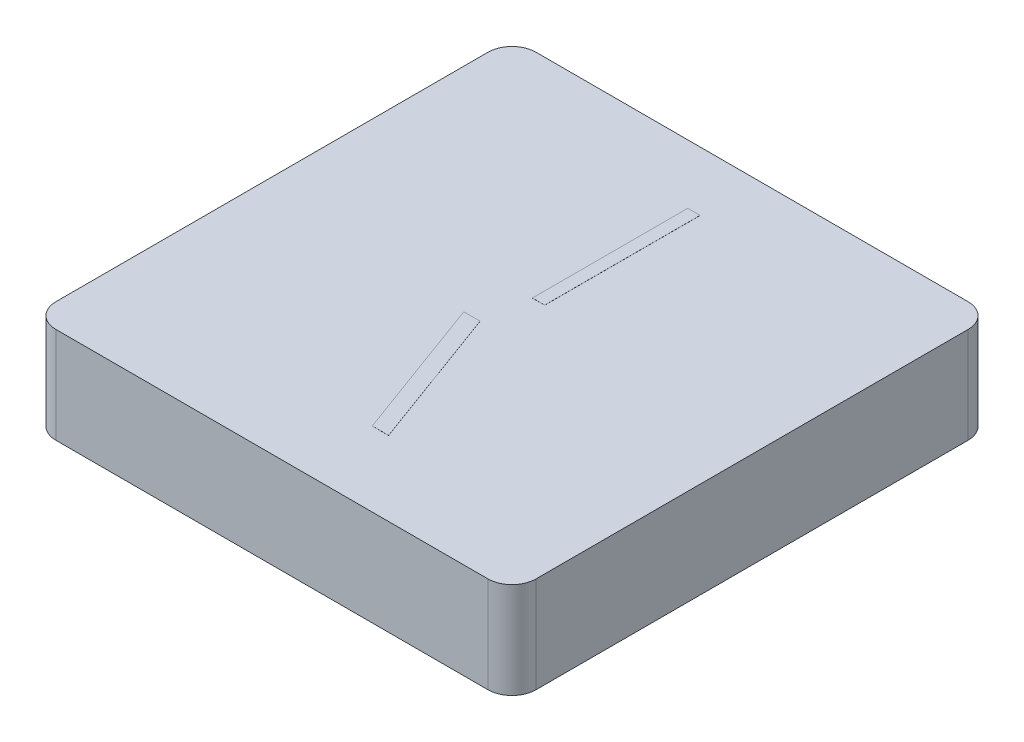
ISO-10303-21;
HEADER;
FILE_DESCRIPTION(('STEP AP214'),'2;1');
FILE_NAME('part.step','',(''),(''),'','','');
FILE_SCHEMA(('AUTOMOTIVE_DESIGN { 1 0 10303 214 1 1 1 1 }'));
ENDSEC;
DATA;
#1=APPLICATION_CONTEXT('core data for automotive mechanical design processes');
#2=APPLICATION_PROTOCOL_DEFINITION('international standard','automotive_design',2000,#1);
#3=PRODUCT_CONTEXT('',#1,'mechanical');
#4=PRODUCT('Part','Part','',(#3));
#5=PRODUCT_RELATED_PRODUCT_CATEGORY('part','',(#4));
#6=PRODUCT_DEFINITION_FORMATION('','',#4);
#7=PRODUCT_DEFINITION_CONTEXT('part definition',#1,'design');
#8=PRODUCT_DEFINITION('design','',#6,#7);
#9=PRODUCT_DEFINITION_SHAPE('','',#8);
#10=(LENGTH_UNIT() NAMED_UNIT(*) SI_UNIT(.MILLI.,.METRE.));
#11=(NAMED_UNIT(*) PLANE_ANGLE_UNIT() SI_UNIT($,.RADIAN.));
#12=(NAMED_UNIT(*) SI_UNIT($,.STERADIAN.) SOLID_ANGLE_UNIT());
#13=UNCERTAINTY_MEASURE_WITH_UNIT(LENGTH_MEASURE(1.E-05),#10,'distance_accuracy_value','');
#14=(GEOMETRIC_REPRESENTATION_CONTEXT(3) GLOBAL_UNCERTAINTY_ASSIGNED_CONTEXT((#13)) GLOBAL_UNIT_ASSIGNED_CONTEXT((#10,
#11,#12)) REPRESENTATION_CONTEXT('',''));
#15=CARTESIAN_POINT('',(0.,0.,0.));
#16=DIRECTION('',(0.,0.,1.));
#17=DIRECTION('',(1.,0.,0.));
#18=AXIS2_PLACEMENT_3D('',#15,#16,#17);
#19=CARTESIAN_POINT('',(0.,2.54,-12.7));
#20=DIRECTION('',(1.,0.,0.));
#21=DIRECTION('',(0.,0.,-1.));
#22=AXIS2_PLACEMENT_3D('',#19,#20,#21);
#23=PLANE('',#22);
#24=DIRECTION('',(0.,0.,1.));
#25=VECTOR('',#24,1.);
#26=CARTESIAN_POINT('',(0.,2.54,-12.7));
#27=LINE('',#26,#25);
#28=CARTESIAN_POINT('',(0.,2.54,-12.065));
#29=VERTEX_POINT('',#28);
#30=CARTESIAN_POINT('',(0.,2.54,-0.635));
#31=VERTEX_POINT('',#30);
#32=EDGE_CURVE('E279',#29,#31,#27,.T.);
#33=ORIENTED_EDGE('',*,*,#32,.F.);
#34=DIRECTION('',(0.,-1.,0.));
#35=VECTOR('',#34,1.);
#36=CARTESIAN_POINT('',(0.,2.54,-12.065));
#37=LINE('',#36,#35);
#38=CARTESIAN_POINT('',(0.,0.,-12.065));
#39=VERTEX_POINT('',#38);
#40=EDGE_CURVE('E304',#29,#39,#37,.T.);
#41=ORIENTED_EDGE('',*,*,#40,.T.);
#42=DIRECTION('',(0.,0.,1.));
#43=VECTOR('',#42,1.);
#44=CARTESIAN_POINT('',(0.,0.,-12.7));
#45=LINE('',#44,#43);
#46=CARTESIAN_POINT('',(0.,0.,-0.635));
#47=VERTEX_POINT('',#46);
#48=EDGE_CURVE('E259',#39,#47,#45,.T.);
#49=ORIENTED_EDGE('',*,*,#48,.T.);
#50=DIRECTION('',(0.,-1.,0.));
#51=VECTOR('',#50,1.);
#52=CARTESIAN_POINT('',(0.,2.54,-0.635));
#53=LINE('',#52,#51);
#54=EDGE_CURVE('E292',#47,#31,#53,.F.);
#55=ORIENTED_EDGE('',*,*,#54,.T.);
#56=EDGE_LOOP('',(#33,#41,#49,#55));
#57=FACE_BOUND('',#56,.T.);
#58=ADVANCED_FACE('F33',(#57),#23,.F.);
#59=CARTESIAN_POINT('',(0.,2.54,0.));
#60=DIRECTION('',(0.,0.,-1.));
#61=DIRECTION('',(-1.,0.,0.));
#62=AXIS2_PLACEMENT_3D('',#59,#60,#61);
#63=PLANE('',#62);
#64=DIRECTION('',(1.,0.,0.));
#65=VECTOR('',#64,1.);
#66=CARTESIAN_POINT('',(0.,0.,0.));
#67=LINE('',#66,#65);
#68=CARTESIAN_POINT('',(0.635,0.,0.));
#69=VERTEX_POINT('',#68);
#70=CARTESIAN_POINT('',(12.065,0.,0.));
#71=VERTEX_POINT('',#70);
#72=EDGE_CURVE('E295',#69,#71,#67,.T.);
#73=ORIENTED_EDGE('',*,*,#72,.T.);
#74=DIRECTION('',(0.,-1.,0.));
#75=VECTOR('',#74,1.);
#76=CARTESIAN_POINT('',(12.065,2.54,0.));
#77=LINE('',#76,#75);
#78=CARTESIAN_POINT('',(12.065,2.54,0.));
#79=VERTEX_POINT('',#78);
#80=EDGE_CURVE('E41',#71,#79,#77,.F.);
#81=ORIENTED_EDGE('',*,*,#80,.T.);
#82=DIRECTION('',(1.,0.,0.));
#83=VECTOR('',#82,1.);
#84=CARTESIAN_POINT('',(0.,2.54,0.));
#85=LINE('',#84,#83);
#86=CARTESIAN_POINT('',(0.635,2.54,0.));
#87=VERTEX_POINT('',#86);
#88=EDGE_CURVE('E282',#87,#79,#85,.T.);
#89=ORIENTED_EDGE('',*,*,#88,.F.);
#90=DIRECTION('',(0.,-1.,0.));
#91=VECTOR('',#90,1.);
#92=CARTESIAN_POINT('',(0.635,2.54,0.));
#93=LINE('',#92,#91);
#94=EDGE_CURVE('E333',#87,#69,#93,.T.);
#95=ORIENTED_EDGE('',*,*,#94,.T.);
#96=EDGE_LOOP('',(#73,#81,#89,#95));
#97=FACE_BOUND('',#96,.T.);
#98=ADVANCED_FACE('F338',(#97),#63,.F.);
#99=CARTESIAN_POINT('',(12.7,2.54,0.));
#100=DIRECTION('',(-1.,0.,0.));
#101=DIRECTION('',(0.,0.,1.));
#102=AXIS2_PLACEMENT_3D('',#99,#100,#101);
#103=PLANE('',#102);
#104=DIRECTION('',(0.,0.,-1.));
#105=VECTOR('',#104,1.);
#106=CARTESIAN_POINT('',(12.7,0.,0.));
#107=LINE('',#106,#105);
#108=CARTESIAN_POINT('',(12.7,0.,-0.635));
#109=VERTEX_POINT('',#108);
#110=CARTESIAN_POINT('',(12.7,0.,-12.065));
#111=VERTEX_POINT('',#110);
#112=EDGE_CURVE('E298',#109,#111,#107,.T.);
#113=ORIENTED_EDGE('',*,*,#112,.T.);
#114=DIRECTION('',(0.,-1.,0.));
#115=VECTOR('',#114,1.);
#116=CARTESIAN_POINT('',(12.7,2.54,-12.065));
#117=LINE('',#116,#115);
#118=CARTESIAN_POINT('',(12.7,2.54,-12.065));
#119=VERTEX_POINT('',#118);
#120=EDGE_CURVE('E331',#111,#119,#117,.F.);
#121=ORIENTED_EDGE('',*,*,#120,.T.);
#122=DIRECTION('',(0.,0.,-1.));
#123=VECTOR('',#122,1.);
#124=CARTESIAN_POINT('',(12.7,2.54,0.));
#125=LINE('',#124,#123);
#126=CARTESIAN_POINT('',(12.7,2.54,-0.635));
#127=VERTEX_POINT('',#126);
#128=EDGE_CURVE('E286',#127,#119,#125,.T.);
#129=ORIENTED_EDGE('',*,*,#128,.F.);
#130=DIRECTION('',(0.,-1.,0.));
#131=VECTOR('',#130,1.);
#132=CARTESIAN_POINT('',(12.7,2.54,-0.635));
#133=LINE('',#132,#131);
#134=EDGE_CURVE('E328',#127,#109,#133,.T.);
#135=ORIENTED_EDGE('',*,*,#134,.T.);
#136=EDGE_LOOP('',(#113,#121,#129,#135));
#137=FACE_BOUND('',#136,.T.);
#138=ADVANCED_FACE('F351',(#137),#103,.F.);
#139=CARTESIAN_POINT('',(12.7,2.54,-12.7));
#140=DIRECTION('',(0.,0.,1.));
#141=DIRECTION('',(1.,0.,0.));
#142=AXIS2_PLACEMENT_3D('',#139,#140,#141);
#143=PLANE('',#142);
#144=DIRECTION('',(-1.,0.,0.));
#145=VECTOR('',#144,1.);
#146=CARTESIAN_POINT('',(12.7,0.,-12.7));
#147=LINE('',#146,#145);
#148=CARTESIAN_POINT('',(12.065,0.,-12.7));
#149=VERTEX_POINT('',#148);
#150=CARTESIAN_POINT('',(0.634999999999995,0.,-12.7));
#151=VERTEX_POINT('',#150);
#152=EDGE_CURVE('E283',#149,#151,#147,.T.);
#153=ORIENTED_EDGE('',*,*,#152,.T.);
#154=DIRECTION('',(0.,-1.,0.));
#155=VECTOR('',#154,1.);
#156=CARTESIAN_POINT('',(0.634999999999995,2.54,-12.7));
#157=LINE('',#156,#155);
#158=CARTESIAN_POINT('',(0.634999999999995,2.54,-12.7));
#159=VERTEX_POINT('',#158);
#160=EDGE_CURVE('E318',#151,#159,#157,.F.);
#161=ORIENTED_EDGE('',*,*,#160,.T.);
#162=DIRECTION('',(-1.,0.,0.));
#163=VECTOR('',#162,1.);
#164=CARTESIAN_POINT('',(12.7,2.54,-12.7));
#165=LINE('',#164,#163);
#166=CARTESIAN_POINT('',(12.065,2.54,-12.7));
#167=VERTEX_POINT('',#166);
#168=EDGE_CURVE('E289',#167,#159,#165,.T.);
#169=ORIENTED_EDGE('',*,*,#168,.F.);
#170=DIRECTION('',(0.,-1.,0.));
#171=VECTOR('',#170,1.);
#172=CARTESIAN_POINT('',(12.065,2.54,-12.7));
#173=LINE('',#172,#171);
#174=EDGE_CURVE('E315',#167,#149,#173,.T.);
#175=ORIENTED_EDGE('',*,*,#174,.T.);
#176=EDGE_LOOP('',(#153,#161,#169,#175));
#177=FACE_BOUND('',#176,.T.);
#178=ADVANCED_FACE('F363',(#177),#143,.F.);
#179=CARTESIAN_POINT('',(0.,2.54,0.));
#180=DIRECTION('',(0.,1.,0.));
#181=DIRECTION('',(0.,0.,1.));
#182=AXIS2_PLACEMENT_3D('',#179,#180,#181);
#183=PLANE('',#182);
#184=DIRECTION('',(0.,0.,-1.));
#185=VECTOR('',#184,1.);
#186=CARTESIAN_POINT('',(6.21974358974359,2.54,-7.01919230769231));
#187=LINE('',#186,#185);
#188=CARTESIAN_POINT('',(6.21974358974359,2.54,-7.01919230769231));
#189=VERTEX_POINT('',#188);
#190=CARTESIAN_POINT('',(6.21974358974359,2.54,-11.1304102564103));
#191=VERTEX_POINT('',#190);
#192=EDGE_CURVE('E199',#189,#191,#187,.T.);
#193=ORIENTED_EDGE('',*,*,#192,.T.);
#194=DIRECTION('',(1.,0.,0.));
#195=VECTOR('',#194,1.);
#196=CARTESIAN_POINT('',(6.21974358974359,2.54,-11.1304102564103));
#197=LINE('',#196,#195);
#198=CARTESIAN_POINT('',(6.54538461538461,2.54,-11.1304102564103));
#199=VERTEX_POINT('',#198);
#200=EDGE_CURVE('E175',#191,#199,#197,.T.);
#201=ORIENTED_EDGE('',*,*,#200,.T.);
#202=DIRECTION('',(0.,0.,1.));
#203=VECTOR('',#202,1.);
#204=CARTESIAN_POINT('',(6.54538461538461,2.54,-11.1304102564103));
#205=LINE('',#204,#203);
#206=CARTESIAN_POINT('',(6.54538461538461,2.54,-7.01919230769231));
#207=VERTEX_POINT('',#206);
#208=EDGE_CURVE('E53',#199,#207,#205,.T.);
#209=ORIENTED_EDGE('',*,*,#208,.T.);
#210=DIRECTION('',(-1.,0.,0.));
#211=VECTOR('',#210,1.);
#212=CARTESIAN_POINT('',(6.54538461538461,2.54,-7.01919230769231));
#213=LINE('',#212,#211);
#214=EDGE_CURVE('E48',#207,#189,#213,.T.);
#215=ORIENTED_EDGE('',*,*,#214,.T.);
#216=EDGE_LOOP('',(#193,#201,#209,#215));
#217=FACE_BOUND('',#216,.T.);
#218=DIRECTION('',(0.344823073975085,0.,0.93866769820548));
#219=VECTOR('',#218,1.);
#220=CARTESIAN_POINT('',(6.05936538461538,2.54,-5.79641025641026));
#221=LINE('',#220,#219);
#222=CARTESIAN_POINT('',(6.05936538461538,2.54,-5.79641025641026));
#223=VERTEX_POINT('',#222);
#224=CARTESIAN_POINT('',(7.46496434294871,2.54,-1.9701282051282));
#225=VERTEX_POINT('',#224);
#226=EDGE_CURVE('E204',#223,#225,#221,.T.);
#227=ORIENTED_EDGE('',*,*,#226,.T.);
#228=DIRECTION('',(-1.,0.,0.));
#229=VECTOR('',#228,1.);
#230=CARTESIAN_POINT('',(7.46496434294871,2.54,-1.9701282051282));
#231=LINE('',#230,#229);
#232=CARTESIAN_POINT('',(7.03374439102564,2.54,-1.9701282051282));
#233=VERTEX_POINT('',#232);
#234=EDGE_CURVE('E223',#225,#233,#231,.T.);
#235=ORIENTED_EDGE('',*,*,#234,.T.);
#236=DIRECTION('',(-0.344823073975085,0.,-0.93866769820548));
#237=VECTOR('',#236,1.);
#238=CARTESIAN_POINT('',(7.03374439102564,2.54,-1.9701282051282));
#239=LINE('',#238,#237);
#240=CARTESIAN_POINT('',(5.6281454326923,2.54,-5.79641025641026));
#241=VERTEX_POINT('',#240);
#242=EDGE_CURVE('E225',#233,#241,#239,.T.);
#243=ORIENTED_EDGE('',*,*,#242,.T.);
#244=DIRECTION('',(1.,0.,0.));
#245=VECTOR('',#244,1.);
#246=CARTESIAN_POINT('',(5.6281454326923,2.54,-5.79641025641026));
#247=LINE('',#246,#245);
#248=EDGE_CURVE('E212',#241,#223,#247,.T.);
#249=ORIENTED_EDGE('',*,*,#248,.T.);
#250=EDGE_LOOP('',(#227,#235,#243,#249));
#251=FACE_BOUND('',#250,.T.);
#252=ORIENTED_EDGE('',*,*,#168,.T.);
#253=CARTESIAN_POINT('',(0.634999999999995,2.54,-12.065));
#254=DIRECTION('',(0.,1.,0.));
#255=DIRECTION('',(0.,0.,1.));
#256=AXIS2_PLACEMENT_3D('',#253,#254,#255);
#257=CIRCLE('',#256,0.635);
#258=EDGE_CURVE('E326',#159,#29,#257,.T.);
#259=ORIENTED_EDGE('',*,*,#258,.T.);
#260=ORIENTED_EDGE('',*,*,#32,.T.);
#261=CARTESIAN_POINT('',(0.635,2.54,-0.635));
#262=DIRECTION('',(0.,1.,0.));
#263=DIRECTION('',(0.,0.,1.));
#264=AXIS2_PLACEMENT_3D('',#261,#262,#263);
#265=CIRCLE('',#264,0.635);
#266=EDGE_CURVE('E320',#31,#87,#265,.T.);
#267=ORIENTED_EDGE('',*,*,#266,.T.);
#268=ORIENTED_EDGE('',*,*,#88,.T.);
#269=CARTESIAN_POINT('',(12.065,2.54,-0.635));
#270=DIRECTION('',(0.,1.,0.));
#271=DIRECTION('',(0.,0.,1.));
#272=AXIS2_PLACEMENT_3D('',#269,#270,#271);
#273=CIRCLE('',#272,0.635);
#274=EDGE_CURVE('E322',#79,#127,#273,.T.);
#275=ORIENTED_EDGE('',*,*,#274,.T.);
#276=ORIENTED_EDGE('',*,*,#128,.T.);
#277=CARTESIAN_POINT('',(12.065,2.54,-12.065));
#278=DIRECTION('',(0.,1.,0.));
#279=DIRECTION('',(0.,0.,1.));
#280=AXIS2_PLACEMENT_3D('',#277,#278,#279);
#281=CIRCLE('',#280,0.635);
#282=EDGE_CURVE('E324',#119,#167,#281,.T.);
#283=ORIENTED_EDGE('',*,*,#282,.T.);
#284=EDGE_LOOP('',(#252,#259,#260,#267,#268,#275,#276,#283));
#285=FACE_BOUND('',#284,.T.);
#286=ADVANCED_FACE('F344',(#217,#251,#285),#183,.T.);
#287=CARTESIAN_POINT('',(0.,0.,0.));
#288=DIRECTION('',(0.,1.,0.));
#289=DIRECTION('',(0.,0.,1.));
#290=AXIS2_PLACEMENT_3D('',#287,#288,#289);
#291=PLANE('',#290);
#292=DIRECTION('',(-1.,0.,0.));
#293=VECTOR('',#292,1.);
#294=CARTESIAN_POINT('',(12.7,0.,-12.065));
#295=LINE('',#294,#293);
#296=CARTESIAN_POINT('',(12.065,0.,-12.065));
#297=VERTEX_POINT('',#296);
#298=CARTESIAN_POINT('',(0.634999999999995,0.,-12.065));
#299=VERTEX_POINT('',#298);
#300=EDGE_CURVE('E247',#297,#299,#295,.T.);
#301=ORIENTED_EDGE('',*,*,#300,.T.);
#302=DIRECTION('',(0.,0.,1.));
#303=VECTOR('',#302,1.);
#304=CARTESIAN_POINT('',(0.634999999999995,0.,-12.7));
#305=LINE('',#304,#303);
#306=CARTESIAN_POINT('',(0.635,0.,-0.635));
#307=VERTEX_POINT('',#306);
#308=EDGE_CURVE('E242',#299,#307,#305,.T.);
#309=ORIENTED_EDGE('',*,*,#308,.T.);
#310=DIRECTION('',(1.,0.,0.));
#311=VECTOR('',#310,1.);
#312=CARTESIAN_POINT('',(0.,0.,-0.635));
#313=LINE('',#312,#311);
#314=CARTESIAN_POINT('',(12.065,0.,-0.635));
#315=VERTEX_POINT('',#314);
#316=EDGE_CURVE('E271',#307,#315,#313,.T.);
#317=ORIENTED_EDGE('',*,*,#316,.T.);
#318=DIRECTION('',(0.,0.,-1.));
#319=VECTOR('',#318,1.);
#320=CARTESIAN_POINT('',(12.065,0.,0.));
#321=LINE('',#320,#319);
#322=EDGE_CURVE('E274',#315,#297,#321,.T.);
#323=ORIENTED_EDGE('',*,*,#322,.T.);
#324=EDGE_LOOP('',(#301,#309,#317,#323));
#325=FACE_BOUND('',#324,.T.);
#326=ORIENTED_EDGE('',*,*,#48,.F.);
#327=CARTESIAN_POINT('',(0.634999999999995,0.,-12.065));
#328=DIRECTION('',(0.,1.,0.));
#329=DIRECTION('',(0.,0.,1.));
#330=AXIS2_PLACEMENT_3D('',#327,#328,#329);
#331=CIRCLE('',#330,0.635);
#332=EDGE_CURVE('E313',#39,#151,#331,.F.);
#333=ORIENTED_EDGE('',*,*,#332,.T.);
#334=ORIENTED_EDGE('',*,*,#152,.F.);
#335=CARTESIAN_POINT('',(12.065,0.,-12.065));
#336=DIRECTION('',(0.,1.,0.));
#337=DIRECTION('',(0.,0.,1.));
#338=AXIS2_PLACEMENT_3D('',#335,#336,#337);
#339=CIRCLE('',#338,0.635);
#340=EDGE_CURVE('E311',#149,#111,#339,.F.);
#341=ORIENTED_EDGE('',*,*,#340,.T.);
#342=ORIENTED_EDGE('',*,*,#112,.F.);
#343=CARTESIAN_POINT('',(12.065,0.,-0.635));
#344=DIRECTION('',(0.,1.,0.));
#345=DIRECTION('',(0.,0.,1.));
#346=AXIS2_PLACEMENT_3D('',#343,#344,#345);
#347=CIRCLE('',#346,0.635);
#348=EDGE_CURVE('E309',#109,#71,#347,.F.);
#349=ORIENTED_EDGE('',*,*,#348,.T.);
#350=ORIENTED_EDGE('',*,*,#72,.F.);
#351=CARTESIAN_POINT('',(0.635,0.,-0.635));
#352=DIRECTION('',(0.,1.,0.));
#353=DIRECTION('',(0.,0.,1.));
#354=AXIS2_PLACEMENT_3D('',#351,#352,#353);
#355=CIRCLE('',#354,0.635);
#356=EDGE_CURVE('E307',#69,#47,#355,.F.);
#357=ORIENTED_EDGE('',*,*,#356,.T.);
#358=EDGE_LOOP('',(#326,#333,#334,#341,#342,#349,#350,#357));
#359=FACE_BOUND('',#358,.T.);
#360=ADVANCED_FACE('F355',(#325,#359),#291,.F.);
#361=CARTESIAN_POINT('',(0.634999999999995,2.54,-12.065));
#362=DIRECTION('',(0.,-1.,0.));
#363=DIRECTION('',(0.,0.,-1.));
#364=AXIS2_PLACEMENT_3D('',#361,#362,#363);
#365=CYLINDRICAL_SURFACE('',#364,0.635);
#366=ORIENTED_EDGE('',*,*,#258,.F.);
#367=ORIENTED_EDGE('',*,*,#160,.F.);
#368=ORIENTED_EDGE('',*,*,#332,.F.);
#369=ORIENTED_EDGE('',*,*,#40,.F.);
#370=EDGE_LOOP('',(#366,#367,#368,#369));
#371=FACE_BOUND('',#370,.T.);
#372=ADVANCED_FACE('F369',(#371),#365,.T.);
#373=CARTESIAN_POINT('',(12.065,2.54,-12.065));
#374=DIRECTION('',(0.,-1.,0.));
#375=DIRECTION('',(0.,0.,-1.));
#376=AXIS2_PLACEMENT_3D('',#373,#374,#375);
#377=CYLINDRICAL_SURFACE('',#376,0.635);
#378=ORIENTED_EDGE('',*,*,#282,.F.);
#379=ORIENTED_EDGE('',*,*,#120,.F.);
#380=ORIENTED_EDGE('',*,*,#340,.F.);
#381=ORIENTED_EDGE('',*,*,#174,.F.);
#382=EDGE_LOOP('',(#378,#379,#380,#381));
#383=FACE_BOUND('',#382,.T.);
#384=ADVANCED_FACE('F360',(#383),#377,.T.);
#385=CARTESIAN_POINT('',(12.065,2.54,-0.635));
#386=DIRECTION('',(0.,-1.,0.));
#387=DIRECTION('',(0.,0.,-1.));
#388=AXIS2_PLACEMENT_3D('',#385,#386,#387);
#389=CYLINDRICAL_SURFACE('',#388,0.635);
#390=ORIENTED_EDGE('',*,*,#274,.F.);
#391=ORIENTED_EDGE('',*,*,#80,.F.);
#392=ORIENTED_EDGE('',*,*,#348,.F.);
#393=ORIENTED_EDGE('',*,*,#134,.F.);
#394=EDGE_LOOP('',(#390,#391,#392,#393));
#395=FACE_BOUND('',#394,.T.);
#396=ADVANCED_FACE('F348',(#395),#389,.T.);
#397=CARTESIAN_POINT('',(0.635,2.54,-0.635));
#398=DIRECTION('',(0.,-1.,0.));
#399=DIRECTION('',(0.,0.,-1.));
#400=AXIS2_PLACEMENT_3D('',#397,#398,#399);
#401=CYLINDRICAL_SURFACE('',#400,0.635);
#402=ORIENTED_EDGE('',*,*,#266,.F.);
#403=ORIENTED_EDGE('',*,*,#54,.F.);
#404=ORIENTED_EDGE('',*,*,#356,.F.);
#405=ORIENTED_EDGE('',*,*,#94,.F.);
#406=EDGE_LOOP('',(#402,#403,#404,#405));
#407=FACE_BOUND('',#406,.T.);
#408=ADVANCED_FACE('F35',(#407),#401,.T.);
#409=CARTESIAN_POINT('',(0.634999999999995,2.54,-12.7));
#410=DIRECTION('',(1.,0.,0.));
#411=DIRECTION('',(0.,0.,-1.));
#412=AXIS2_PLACEMENT_3D('',#409,#410,#411);
#413=PLANE('',#412);
#414=DIRECTION('',(0.,0.,1.));
#415=VECTOR('',#414,1.);
#416=CARTESIAN_POINT('',(0.634999999999995,1.905,-12.7));
#417=LINE('',#416,#415);
#418=CARTESIAN_POINT('',(0.634999999999995,1.905,-12.065));
#419=VERTEX_POINT('',#418);
#420=CARTESIAN_POINT('',(0.635,1.905,-0.635));
#421=VERTEX_POINT('',#420);
#422=EDGE_CURVE('E243',#419,#421,#417,.T.);
#423=ORIENTED_EDGE('',*,*,#422,.T.);
#424=DIRECTION('',(0.,1.,0.));
#425=VECTOR('',#424,1.);
#426=CARTESIAN_POINT('',(0.635,2.54,-0.635));
#427=LINE('',#426,#425);
#428=EDGE_CURVE('E252',#307,#421,#427,.T.);
#429=ORIENTED_EDGE('',*,*,#428,.F.);
#430=ORIENTED_EDGE('',*,*,#308,.F.);
#431=DIRECTION('',(0.,1.,0.));
#432=VECTOR('',#431,1.);
#433=CARTESIAN_POINT('',(0.634999999999995,2.54,-12.065));
#434=LINE('',#433,#432);
#435=EDGE_CURVE('E248',#299,#419,#434,.T.);
#436=ORIENTED_EDGE('',*,*,#435,.T.);
#437=EDGE_LOOP('',(#423,#429,#430,#436));
#438=FACE_BOUND('',#437,.T.);
#439=ADVANCED_FACE('F374',(#438),#413,.T.);
#440=CARTESIAN_POINT('',(0.,2.54,-0.635));
#441=DIRECTION('',(0.,0.,-1.));
#442=DIRECTION('',(-1.,0.,0.));
#443=AXIS2_PLACEMENT_3D('',#440,#441,#442);
#444=PLANE('',#443);
#445=ORIENTED_EDGE('',*,*,#316,.F.);
#446=ORIENTED_EDGE('',*,*,#428,.T.);
#447=DIRECTION('',(1.,0.,0.));
#448=VECTOR('',#447,1.);
#449=CARTESIAN_POINT('',(0.,1.905,-0.635));
#450=LINE('',#449,#448);
#451=CARTESIAN_POINT('',(12.065,1.905,-0.635));
#452=VERTEX_POINT('',#451);
#453=EDGE_CURVE('E246',#421,#452,#450,.T.);
#454=ORIENTED_EDGE('',*,*,#453,.T.);
#455=DIRECTION('',(0.,1.,0.));
#456=VECTOR('',#455,1.);
#457=CARTESIAN_POINT('',(12.065,2.54,-0.635));
#458=LINE('',#457,#456);
#459=EDGE_CURVE('E256',#315,#452,#458,.T.);
#460=ORIENTED_EDGE('',*,*,#459,.F.);
#461=EDGE_LOOP('',(#445,#446,#454,#460));
#462=FACE_BOUND('',#461,.T.);
#463=ADVANCED_FACE('F379',(#462),#444,.T.);
#464=CARTESIAN_POINT('',(12.065,2.54,0.));
#465=DIRECTION('',(-1.,0.,0.));
#466=DIRECTION('',(0.,0.,1.));
#467=AXIS2_PLACEMENT_3D('',#464,#465,#466);
#468=PLANE('',#467);
#469=ORIENTED_EDGE('',*,*,#322,.F.);
#470=ORIENTED_EDGE('',*,*,#459,.T.);
#471=DIRECTION('',(0.,0.,-1.));
#472=VECTOR('',#471,1.);
#473=CARTESIAN_POINT('',(12.065,1.905,0.));
#474=LINE('',#473,#472);
#475=CARTESIAN_POINT('',(12.065,1.905,-12.065));
#476=VERTEX_POINT('',#475);
#477=EDGE_CURVE('E262',#452,#476,#474,.T.);
#478=ORIENTED_EDGE('',*,*,#477,.T.);
#479=DIRECTION('',(0.,1.,0.));
#480=VECTOR('',#479,1.);
#481=CARTESIAN_POINT('',(12.065,2.54,-12.065));
#482=LINE('',#481,#480);
#483=EDGE_CURVE('E251',#297,#476,#482,.T.);
#484=ORIENTED_EDGE('',*,*,#483,.F.);
#485=EDGE_LOOP('',(#469,#470,#478,#484));
#486=FACE_BOUND('',#485,.T.);
#487=ADVANCED_FACE('F432',(#486),#468,.T.);
#488=CARTESIAN_POINT('',(12.7,2.54,-12.065));
#489=DIRECTION('',(0.,0.,1.));
#490=DIRECTION('',(1.,0.,0.));
#491=AXIS2_PLACEMENT_3D('',#488,#489,#490);
#492=PLANE('',#491);
#493=ORIENTED_EDGE('',*,*,#300,.F.);
#494=ORIENTED_EDGE('',*,*,#483,.T.);
#495=DIRECTION('',(-1.,0.,0.));
#496=VECTOR('',#495,1.);
#497=CARTESIAN_POINT('',(12.7,1.905,-12.065));
#498=LINE('',#497,#496);
#499=EDGE_CURVE('E255',#476,#419,#498,.T.);
#500=ORIENTED_EDGE('',*,*,#499,.T.);
#501=ORIENTED_EDGE('',*,*,#435,.F.);
#502=EDGE_LOOP('',(#493,#494,#500,#501));
#503=FACE_BOUND('',#502,.T.);
#504=ADVANCED_FACE('F442',(#503),#492,.T.);
#505=CARTESIAN_POINT('',(0.,1.905,0.));
#506=DIRECTION('',(0.,1.,0.));
#507=DIRECTION('',(0.,0.,1.));
#508=AXIS2_PLACEMENT_3D('',#505,#506,#507);
#509=PLANE('',#508);
#510=CARTESIAN_POINT('',(6.34999999999999,1.905,-6.35));
#511=DIRECTION('',(0.,1.,0.));
#512=DIRECTION('',(0.,0.,1.));
#513=AXIS2_PLACEMENT_3D('',#510,#511,#512);
#514=CIRCLE('',#513,2.54);
#515=CARTESIAN_POINT('',(6.34999999999999,1.905,-3.81));
#516=VERTEX_POINT('',#515);
#517=EDGE_CURVE('E11',#516,#516,#514,.F.);
#518=ORIENTED_EDGE('',*,*,#517,.F.);
#519=EDGE_LOOP('',(#518));
#520=FACE_BOUND('',#519,.T.);
#521=ORIENTED_EDGE('',*,*,#499,.F.);
#522=ORIENTED_EDGE('',*,*,#477,.F.);
#523=ORIENTED_EDGE('',*,*,#453,.F.);
#524=ORIENTED_EDGE('',*,*,#422,.F.);
#525=EDGE_LOOP('',(#521,#522,#523,#524));
#526=FACE_BOUND('',#525,.T.);
#527=ADVANCED_FACE('F452',(#520,#526),#509,.F.);
#528=CARTESIAN_POINT('',(6.34999999999999,-7.18420489685532,-6.35));
#529=DIRECTION('',(0.,1.,0.));
#530=DIRECTION('',(0.,0.,1.));
#531=AXIS2_PLACEMENT_3D('',#528,#529,#530);
#532=CYLINDRICAL_SURFACE('',#531,2.54);
#533=CARTESIAN_POINT('',(6.34999999999999,0.,-6.35));
#534=DIRECTION('',(0.,1.,0.));
#535=DIRECTION('',(0.,0.,1.));
#536=AXIS2_PLACEMENT_3D('',#533,#534,#535);
#537=CIRCLE('',#536,2.54);
#538=CARTESIAN_POINT('',(6.34999999999999,0.,-3.81));
#539=VERTEX_POINT('',#538);
#540=EDGE_CURVE('E231',#539,#539,#537,.T.);
#541=CARTESIAN_POINT('',(6.34999999999999,0.,-3.81));
#542=CARTESIAN_POINT('',(6.34999999999999,0.0198437499999991,-3.81));
#543=CARTESIAN_POINT('',(6.34999999999999,0.0396874999999989,-3.81));
#544=CARTESIAN_POINT('',(6.34999999999999,0.079374999999999,-3.81));
#545=CARTESIAN_POINT('',(6.34999999999999,0.0992187499999992,-3.81));
#546=CARTESIAN_POINT('',(6.34999999999999,0.138906249999999,-3.81));
#547=CARTESIAN_POINT('',(6.34999999999999,0.158749999999999,-3.81));
#548=CARTESIAN_POINT('',(6.34999999999999,0.198437499999999,-3.81));
#549=CARTESIAN_POINT('',(6.34999999999999,0.218281249999999,-3.81));
#550=CARTESIAN_POINT('',(6.34999999999999,0.25796875,-3.81));
#551=CARTESIAN_POINT('',(6.34999999999999,0.277812499999999,-3.81));
#552=CARTESIAN_POINT('',(6.34999999999999,0.317499999999999,-3.81));
#553=CARTESIAN_POINT('',(6.34999999999999,0.337343749999999,-3.81));
#554=CARTESIAN_POINT('',(6.34999999999999,0.377031249999999,-3.81));
#555=CARTESIAN_POINT('',(6.34999999999999,0.396874999999999,-3.81));
#556=CARTESIAN_POINT('',(6.34999999999999,0.436562499999999,-3.81));
#557=CARTESIAN_POINT('',(6.34999999999999,0.456406249999999,-3.81));
#558=CARTESIAN_POINT('',(6.34999999999999,0.496093749999999,-3.81));
#559=CARTESIAN_POINT('',(6.34999999999999,0.515937499999999,-3.81));
#560=CARTESIAN_POINT('',(6.34999999999999,0.555624999999999,-3.81));
#561=CARTESIAN_POINT('',(6.34999999999999,0.575468749999999,-3.81));
#562=CARTESIAN_POINT('',(6.34999999999999,0.615156249999999,-3.81));
#563=CARTESIAN_POINT('',(6.34999999999999,0.634999999999999,-3.81));
#564=CARTESIAN_POINT('',(6.34999999999999,0.674687499999998,-3.81));
#565=CARTESIAN_POINT('',(6.34999999999999,0.694531249999998,-3.81));
#566=CARTESIAN_POINT('',(6.34999999999999,0.734218749999998,-3.81));
#567=CARTESIAN_POINT('',(6.34999999999999,0.754062499999998,-3.81));
#568=CARTESIAN_POINT('',(6.34999999999999,0.793749999999998,-3.81));
#569=CARTESIAN_POINT('',(6.34999999999999,0.813593749999999,-3.81));
#570=CARTESIAN_POINT('',(6.34999999999999,0.853281249999999,-3.81));
#571=CARTESIAN_POINT('',(6.34999999999999,0.873124999999999,-3.81));
#572=CARTESIAN_POINT('',(6.34999999999999,0.912812499999999,-3.81));
#573=CARTESIAN_POINT('',(6.34999999999999,0.932656249999999,-3.81));
#574=CARTESIAN_POINT('',(6.34999999999999,0.972343749999998,-3.81));
#575=CARTESIAN_POINT('',(6.34999999999999,0.992187499999998,-3.81));
#576=CARTESIAN_POINT('',(6.34999999999999,1.031875,-3.81));
#577=CARTESIAN_POINT('',(6.34999999999999,1.05171875,-3.81));
#578=CARTESIAN_POINT('',(6.34999999999999,1.09140625,-3.81));
#579=CARTESIAN_POINT('',(6.34999999999999,1.11125,-3.81));
#580=CARTESIAN_POINT('',(6.34999999999999,1.1509375,-3.81));
#581=CARTESIAN_POINT('',(6.34999999999999,1.17078125,-3.81));
#582=CARTESIAN_POINT('',(6.34999999999999,1.21046875,-3.81));
#583=CARTESIAN_POINT('',(6.34999999999999,1.2303125,-3.81));
#584=CARTESIAN_POINT('',(6.34999999999999,1.27,-3.81));
#585=CARTESIAN_POINT('',(6.34999999999999,1.28984375,-3.81));
#586=CARTESIAN_POINT('',(6.34999999999999,1.32953125,-3.81));
#587=CARTESIAN_POINT('',(6.34999999999999,1.349375,-3.81));
#588=CARTESIAN_POINT('',(6.34999999999999,1.3890625,-3.81));
#589=CARTESIAN_POINT('',(6.34999999999999,1.40890625,-3.81));
#590=CARTESIAN_POINT('',(6.34999999999999,1.44859375,-3.81));
#591=CARTESIAN_POINT('',(6.34999999999999,1.4684375,-3.81));
#592=CARTESIAN_POINT('',(6.34999999999999,1.508125,-3.81));
#593=CARTESIAN_POINT('',(6.34999999999999,1.52796875,-3.81));
#594=CARTESIAN_POINT('',(6.34999999999999,1.56765625,-3.81));
#595=CARTESIAN_POINT('',(6.34999999999999,1.5875,-3.81));
#596=CARTESIAN_POINT('',(6.34999999999999,1.6271875,-3.81));
#597=CARTESIAN_POINT('',(6.34999999999999,1.64703125,-3.81));
#598=CARTESIAN_POINT('',(6.34999999999999,1.68671875,-3.81));
#599=CARTESIAN_POINT('',(6.34999999999999,1.7065625,-3.81));
#600=CARTESIAN_POINT('',(6.34999999999999,1.74625,-3.81));
#601=CARTESIAN_POINT('',(6.34999999999999,1.76609375,-3.81));
#602=CARTESIAN_POINT('',(6.34999999999999,1.80578125,-3.81));
#603=CARTESIAN_POINT('',(6.34999999999999,1.825625,-3.81));
#604=CARTESIAN_POINT('',(6.34999999999999,1.8653125,-3.81));
#605=CARTESIAN_POINT('',(6.34999999999999,1.88515625,-3.81));
#606=CARTESIAN_POINT('',(6.34999999999999,1.905,-3.81));
#607=B_SPLINE_CURVE_WITH_KNOTS('',3,(#541,#542,#543,#544,#545,#546,#547,#548,#549,#550,#551,
#552,#553,#554,#555,#556,#557,#558,#559,#560,#561,#562,#563,#564,#565,#566,#567,#568,#569,#570,
#571,#572,#573,#574,#575,#576,#577,#578,#579,#580,#581,#582,#583,#584,#585,#586,#587,#588,#589,
#590,#591,#592,#593,#594,#595,#596,#597,#598,#599,#600,#601,#602,#603,#604,#605,#606),
.UNSPECIFIED.,.F.,.F.,(4,2,2,2,2,2,2,2,2,2,2,2,2,2,2,2,2,2,2,2,2,2,2,2,2,2,2,2,2,2,2,2,4),(0.,
0.0595312499999997,0.1190625,0.17859375,0.238125,0.29765625,0.3571875,0.41671875,0.47625,
0.53578125,0.5953125,0.654843749999999,0.714374999999999,0.773906249999999,0.8334375,0.89296875,
0.952499999999999,1.01203125,1.0715625,1.13109375,1.190625,1.25015625,1.3096875,1.36921875,
1.42875,1.48828125,1.5478125,1.60734375,1.666875,1.72640625,1.7859375,1.84546875,1.905),.UNSPECIFIED.);
#608=EDGE_CURVE('BSEAM462',#539,#516,#607,.T.);
#609=ORIENTED_EDGE('',*,*,#540,.T.);
#610=ORIENTED_EDGE('',*,*,#517,.T.);
#611=ORIENTED_EDGE('',*,*,#608,.T.);
#612=ORIENTED_EDGE('',*,*,#608,.F.);
#613=EDGE_LOOP('',(#609,#611,#610,#612));
#614=FACE_BOUND('',#613,.T.);
#615=ADVANCED_FACE('F462',(#614),#532,.T.);
#616=CARTESIAN_POINT('',(0.,0.,0.));
#617=DIRECTION('',(0.,1.,0.));
#618=DIRECTION('',(0.,0.,1.));
#619=AXIS2_PLACEMENT_3D('',#616,#617,#618);
#620=PLANE('',#619);
#621=ORIENTED_EDGE('',*,*,#540,.F.);
#622=EDGE_LOOP('',(#621));
#623=FACE_BOUND('',#622,.T.);
#624=ADVANCED_FACE('F472',(#623),#620,.F.);
#625=CARTESIAN_POINT('',(6.05936538461538,2.54254,-5.79641025641026));
#626=DIRECTION('',(0.938667698205479,0.,-0.344823073975085));
#627=DIRECTION('',(-0.344823073975085,0.,-0.93866769820548));
#628=AXIS2_PLACEMENT_3D('',#625,#626,#627);
#629=PLANE('',#628);
#630=ORIENTED_EDGE('',*,*,#226,.F.);
#631=DIRECTION('',(0.,-1.,0.));
#632=VECTOR('',#631,1.);
#633=CARTESIAN_POINT('',(6.05936538461538,2.54254,-5.79641025641026));
#634=LINE('',#633,#632);
#635=CARTESIAN_POINT('',(6.05936538461538,2.54254,-5.79641025641026));
#636=VERTEX_POINT('',#635);
#637=EDGE_CURVE('E228',#636,#223,#634,.T.);
#638=ORIENTED_EDGE('',*,*,#637,.F.);
#639=DIRECTION('',(0.344823073975085,0.,0.93866769820548));
#640=VECTOR('',#639,1.);
#641=CARTESIAN_POINT('',(6.05936538461538,2.54254,-5.79641025641026));
#642=LINE('',#641,#640);
#643=CARTESIAN_POINT('',(7.46496434294871,2.54254,-1.9701282051282));
#644=VERTEX_POINT('',#643);
#645=EDGE_CURVE('E208',#636,#644,#642,.T.);
#646=ORIENTED_EDGE('',*,*,#645,.T.);
#647=DIRECTION('',(0.,-1.,0.));
#648=VECTOR('',#647,1.);
#649=CARTESIAN_POINT('',(7.46496434294871,2.54254,-1.9701282051282));
#650=LINE('',#649,#648);
#651=EDGE_CURVE('E221',#644,#225,#650,.T.);
#652=ORIENTED_EDGE('',*,*,#651,.T.);
#653=EDGE_LOOP('',(#630,#638,#646,#652));
#654=FACE_BOUND('',#653,.T.);
#655=ADVANCED_FACE('F482',(#654),#629,.T.);
#656=CARTESIAN_POINT('',(5.6281454326923,2.54254,-5.79641025641026));
#657=DIRECTION('',(0.,0.,-1.));
#658=DIRECTION('',(-1.,0.,0.));
#659=AXIS2_PLACEMENT_3D('',#656,#657,#658);
#660=PLANE('',#659);
#661=ORIENTED_EDGE('',*,*,#248,.F.);
#662=DIRECTION('',(0.,-1.,0.));
#663=VECTOR('',#662,1.);
#664=CARTESIAN_POINT('',(5.6281454326923,2.54254,-5.79641025641026));
#665=LINE('',#664,#663);
#666=CARTESIAN_POINT('',(5.6281454326923,2.54254,-5.79641025641026));
#667=VERTEX_POINT('',#666);
#668=EDGE_CURVE('E232',#667,#241,#665,.T.);
#669=ORIENTED_EDGE('',*,*,#668,.F.);
#670=DIRECTION('',(1.,0.,0.));
#671=VECTOR('',#670,1.);
#672=CARTESIAN_POINT('',(5.6281454326923,2.54254,-5.79641025641026));
#673=LINE('',#672,#671);
#674=EDGE_CURVE('E218',#667,#636,#673,.T.);
#675=ORIENTED_EDGE('',*,*,#674,.T.);
#676=ORIENTED_EDGE('',*,*,#637,.T.);
#677=EDGE_LOOP('',(#661,#669,#675,#676));
#678=FACE_BOUND('',#677,.T.);
#679=ADVANCED_FACE('F500',(#678),#660,.T.);
#680=CARTESIAN_POINT('',(7.03374439102564,2.54254,-1.9701282051282));
#681=DIRECTION('',(-0.93866769820548,0.,0.344823073975085));
#682=DIRECTION('',(0.344823073975085,0.,0.93866769820548));
#683=AXIS2_PLACEMENT_3D('',#680,#681,#682);
#684=PLANE('',#683);
#685=ORIENTED_EDGE('',*,*,#242,.F.);
#686=DIRECTION('',(0.,-1.,0.));
#687=VECTOR('',#686,1.);
#688=CARTESIAN_POINT('',(7.03374439102564,2.54254,-1.9701282051282));
#689=LINE('',#688,#687);
#690=CARTESIAN_POINT('',(7.03374439102564,2.54254,-1.9701282051282));
#691=VERTEX_POINT('',#690);
#692=EDGE_CURVE('E235',#691,#233,#689,.T.);
#693=ORIENTED_EDGE('',*,*,#692,.F.);
#694=DIRECTION('',(-0.344823073975085,0.,-0.93866769820548));
#695=VECTOR('',#694,1.);
#696=CARTESIAN_POINT('',(7.03374439102564,2.54254,-1.9701282051282));
#697=LINE('',#696,#695);
#698=EDGE_CURVE('E215',#691,#667,#697,.T.);
#699=ORIENTED_EDGE('',*,*,#698,.T.);
#700=ORIENTED_EDGE('',*,*,#668,.T.);
#701=EDGE_LOOP('',(#685,#693,#699,#700));
#702=FACE_BOUND('',#701,.T.);
#703=ADVANCED_FACE('F510',(#702),#684,.T.);
#704=CARTESIAN_POINT('',(7.46496434294871,2.54254,-1.9701282051282));
#705=DIRECTION('',(0.,0.,1.));
#706=DIRECTION('',(1.,0.,0.));
#707=AXIS2_PLACEMENT_3D('',#704,#705,#706);
#708=PLANE('',#707);
#709=ORIENTED_EDGE('',*,*,#234,.F.);
#710=ORIENTED_EDGE('',*,*,#651,.F.);
#711=DIRECTION('',(-1.,0.,0.));
#712=VECTOR('',#711,1.);
#713=CARTESIAN_POINT('',(7.46496434294871,2.54254,-1.9701282051282));
#714=LINE('',#713,#712);
#715=EDGE_CURVE('E211',#644,#691,#714,.T.);
#716=ORIENTED_EDGE('',*,*,#715,.T.);
#717=ORIENTED_EDGE('',*,*,#692,.T.);
#718=EDGE_LOOP('',(#709,#710,#716,#717));
#719=FACE_BOUND('',#718,.T.);
#720=ADVANCED_FACE('F520',(#719),#708,.T.);
#721=CARTESIAN_POINT('',(0.,2.54254,0.));
#722=DIRECTION('',(0.,-1.,0.));
#723=DIRECTION('',(0.,0.,-1.));
#724=AXIS2_PLACEMENT_3D('',#721,#722,#723);
#725=PLANE('',#724);
#726=ORIENTED_EDGE('',*,*,#645,.F.);
#727=ORIENTED_EDGE('',*,*,#674,.F.);
#728=ORIENTED_EDGE('',*,*,#698,.F.);
#729=ORIENTED_EDGE('',*,*,#715,.F.);
#730=EDGE_LOOP('',(#726,#727,#728,#729));
#731=FACE_BOUND('',#730,.T.);
#732=ADVANCED_FACE('F530',(#731),#725,.F.);
#733=CARTESIAN_POINT('',(6.21974358974359,2.54254,-7.01919230769231));
#734=DIRECTION('',(-1.,0.,0.));
#735=DIRECTION('',(0.,0.,1.));
#736=AXIS2_PLACEMENT_3D('',#733,#734,#735);
#737=PLANE('',#736);
#738=ORIENTED_EDGE('',*,*,#192,.F.);
#739=DIRECTION('',(0.,-1.,0.));
#740=VECTOR('',#739,1.);
#741=CARTESIAN_POINT('',(6.21974358974359,2.54254,-7.01919230769231));
#742=LINE('',#741,#740);
#743=CARTESIAN_POINT('',(6.21974358974359,2.54254,-7.01919230769231));
#744=VERTEX_POINT('',#743);
#745=EDGE_CURVE('E193',#744,#189,#742,.T.);
#746=ORIENTED_EDGE('',*,*,#745,.F.);
#747=DIRECTION('',(0.,0.,-1.));
#748=VECTOR('',#747,1.);
#749=CARTESIAN_POINT('',(6.21974358974359,2.54254,-7.01919230769231));
#750=LINE('',#749,#748);
#751=CARTESIAN_POINT('',(6.21974358974359,2.54254,-11.1304102564103));
#752=VERTEX_POINT('',#751);
#753=EDGE_CURVE('E187',#744,#752,#750,.T.);
#754=ORIENTED_EDGE('',*,*,#753,.T.);
#755=DIRECTION('',(0.,-1.,0.));
#756=VECTOR('',#755,1.);
#757=CARTESIAN_POINT('',(6.21974358974359,2.54254,-11.1304102564103));
#758=LINE('',#757,#756);
#759=EDGE_CURVE('E170',#752,#191,#758,.T.);
#760=ORIENTED_EDGE('',*,*,#759,.T.);
#761=EDGE_LOOP('',(#738,#746,#754,#760));
#762=FACE_BOUND('',#761,.T.);
#763=ADVANCED_FACE('F192',(#762),#737,.T.);
#764=CARTESIAN_POINT('',(6.54538461538461,2.54254,-7.01919230769231));
#765=DIRECTION('',(0.,0.,1.));
#766=DIRECTION('',(1.,0.,0.));
#767=AXIS2_PLACEMENT_3D('',#764,#765,#766);
#768=PLANE('',#767);
#769=ORIENTED_EDGE('',*,*,#214,.F.);
#770=DIRECTION('',(0.,-1.,0.));
#771=VECTOR('',#770,1.);
#772=CARTESIAN_POINT('',(6.54538461538461,2.54254,-7.01919230769231));
#773=LINE('',#772,#771);
#774=CARTESIAN_POINT('',(6.54538461538461,2.54254,-7.01919230769231));
#775=VERTEX_POINT('',#774);
#776=EDGE_CURVE('E205',#775,#207,#773,.T.);
#777=ORIENTED_EDGE('',*,*,#776,.F.);
#778=DIRECTION('',(-1.,0.,0.));
#779=VECTOR('',#778,1.);
#780=CARTESIAN_POINT('',(6.54538461538461,2.54254,-7.01919230769231));
#781=LINE('',#780,#779);
#782=EDGE_CURVE('E180',#775,#744,#781,.T.);
#783=ORIENTED_EDGE('',*,*,#782,.T.);
#784=ORIENTED_EDGE('',*,*,#745,.T.);
#785=EDGE_LOOP('',(#769,#777,#783,#784));
#786=FACE_BOUND('',#785,.T.);
#787=ADVANCED_FACE('F549',(#786),#768,.T.);
#788=CARTESIAN_POINT('',(6.54538461538461,2.54254,-11.1304102564103));
#789=DIRECTION('',(1.,0.,0.));
#790=DIRECTION('',(0.,0.,-1.));
#791=AXIS2_PLACEMENT_3D('',#788,#789,#790);
#792=PLANE('',#791);
#793=ORIENTED_EDGE('',*,*,#208,.F.);
#794=DIRECTION('',(0.,-1.,0.));
#795=VECTOR('',#794,1.);
#796=CARTESIAN_POINT('',(6.54538461538461,2.54254,-11.1304102564103));
#797=LINE('',#796,#795);
#798=CARTESIAN_POINT('',(6.54538461538461,2.54254,-11.1304102564103));
#799=VERTEX_POINT('',#798);
#800=EDGE_CURVE('E179',#799,#199,#797,.T.);
#801=ORIENTED_EDGE('',*,*,#800,.F.);
#802=DIRECTION('',(0.,0.,1.));
#803=VECTOR('',#802,1.);
#804=CARTESIAN_POINT('',(6.54538461538461,2.54254,-11.1304102564103));
#805=LINE('',#804,#803);
#806=EDGE_CURVE('E190',#799,#775,#805,.T.);
#807=ORIENTED_EDGE('',*,*,#806,.T.);
#808=ORIENTED_EDGE('',*,*,#776,.T.);
#809=EDGE_LOOP('',(#793,#801,#807,#808));
#810=FACE_BOUND('',#809,.T.);
#811=ADVANCED_FACE('F558',(#810),#792,.T.);
#812=CARTESIAN_POINT('',(6.21974358974359,2.54254,-11.1304102564103));
#813=DIRECTION('',(0.,0.,-1.));
#814=DIRECTION('',(-1.,0.,0.));
#815=AXIS2_PLACEMENT_3D('',#812,#813,#814);
#816=PLANE('',#815);
#817=ORIENTED_EDGE('',*,*,#200,.F.);
#818=ORIENTED_EDGE('',*,*,#759,.F.);
#819=DIRECTION('',(1.,0.,0.));
#820=VECTOR('',#819,1.);
#821=CARTESIAN_POINT('',(6.21974358974359,2.54254,-11.1304102564103));
#822=LINE('',#821,#820);
#823=EDGE_CURVE('E174',#752,#799,#822,.T.);
#824=ORIENTED_EDGE('',*,*,#823,.T.);
#825=ORIENTED_EDGE('',*,*,#800,.T.);
#826=EDGE_LOOP('',(#817,#818,#824,#825));
#827=FACE_BOUND('',#826,.T.);
#828=ADVANCED_FACE('F172',(#827),#816,.T.);
#829=CARTESIAN_POINT('',(0.,2.54254,0.));
#830=DIRECTION('',(0.,-1.,0.));
#831=DIRECTION('',(0.,0.,-1.));
#832=AXIS2_PLACEMENT_3D('',#829,#830,#831);
#833=PLANE('',#832);
#834=ORIENTED_EDGE('',*,*,#753,.F.);
#835=ORIENTED_EDGE('',*,*,#782,.F.);
#836=ORIENTED_EDGE('',*,*,#806,.F.);
#837=ORIENTED_EDGE('',*,*,#823,.F.);
#838=EDGE_LOOP('',(#834,#835,#836,#837));
#839=FACE_BOUND('',#838,.T.);
#840=ADVANCED_FACE('F185',(#839),#833,.F.);
#841=CLOSED_SHELL('',(#58,#98,#138,#178,#286,#360,#372,#384,#396,#408,#439,#463,#487,#504,#527,
#615,#624,#655,#679,#703,#720,#732,#763,#787,#811,#828,#840));
#842=MANIFOLD_SOLID_BREP('B2',#841);
#843=ADVANCED_BREP_SHAPE_REPRESENTATION('',(#18,#842),#14);
#844=SHAPE_DEFINITION_REPRESENTATION(#9,#843);
ENDSEC;
END-ISO-10303-21;
